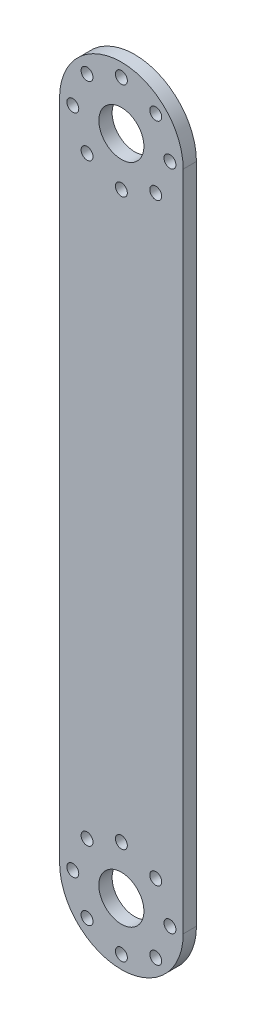
ISO-10303-21;
HEADER;
FILE_DESCRIPTION(('STEP AP214'),'2;1');
FILE_NAME('part.step','',(''),(''),'','','');
FILE_SCHEMA(('AUTOMOTIVE_DESIGN { 1 0 10303 214 1 1 1 1 }'));
ENDSEC;
DATA;
#1=APPLICATION_CONTEXT('core data for automotive mechanical design processes');
#2=APPLICATION_PROTOCOL_DEFINITION('international standard','automotive_design',2000,#1);
#3=PRODUCT_CONTEXT('',#1,'mechanical');
#4=PRODUCT('Part','Part','',(#3));
#5=PRODUCT_RELATED_PRODUCT_CATEGORY('part','',(#4));
#6=PRODUCT_DEFINITION_FORMATION('','',#4);
#7=PRODUCT_DEFINITION_CONTEXT('part definition',#1,'design');
#8=PRODUCT_DEFINITION('design','',#6,#7);
#9=PRODUCT_DEFINITION_SHAPE('','',#8);
#10=(LENGTH_UNIT() NAMED_UNIT(*) SI_UNIT(.MILLI.,.METRE.));
#11=(NAMED_UNIT(*) PLANE_ANGLE_UNIT() SI_UNIT($,.RADIAN.));
#12=(NAMED_UNIT(*) SI_UNIT($,.STERADIAN.) SOLID_ANGLE_UNIT());
#13=UNCERTAINTY_MEASURE_WITH_UNIT(LENGTH_MEASURE(1.E-05),#10,'distance_accuracy_value','');
#14=(GEOMETRIC_REPRESENTATION_CONTEXT(3) GLOBAL_UNCERTAINTY_ASSIGNED_CONTEXT((#13)) GLOBAL_UNIT_ASSIGNED_CONTEXT((#10,
#11,#12)) REPRESENTATION_CONTEXT('',''));
#15=CARTESIAN_POINT('',(0.,0.,0.));
#16=DIRECTION('',(0.,0.,1.));
#17=DIRECTION('',(1.,0.,0.));
#18=AXIS2_PLACEMENT_3D('',#15,#16,#17);
#19=CARTESIAN_POINT('',(0.,0.,3.));
#20=DIRECTION('',(0.,0.,1.));
#21=DIRECTION('',(1.,0.,0.));
#22=AXIS2_PLACEMENT_3D('',#19,#20,#21);
#23=PLANE('',#22);
#24=CARTESIAN_POINT('',(11.,-1.15218884181823E-13,3.));
#25=DIRECTION('',(0.,0.,1.));
#26=DIRECTION('',(1.,0.,0.));
#27=AXIS2_PLACEMENT_3D('',#24,#25,#26);
#28=CIRCLE('',#27,1.35);
#29=CARTESIAN_POINT('',(12.35,-1.15218884181823E-13,3.));
#30=VERTEX_POINT('',#29);
#31=EDGE_CURVE('E206',#30,#30,#28,.T.);
#32=ORIENTED_EDGE('',*,*,#31,.F.);
#33=EDGE_LOOP('',(#32));
#34=FACE_BOUND('',#33,.T.);
#35=CARTESIAN_POINT('',(0.,11.,3.));
#36=DIRECTION('',(0.,0.,1.));
#37=DIRECTION('',(1.,0.,0.));
#38=AXIS2_PLACEMENT_3D('',#35,#36,#37);
#39=CIRCLE('',#38,1.35);
#40=CARTESIAN_POINT('',(1.35000000000008,11.,3.));
#41=VERTEX_POINT('',#40);
#42=EDGE_CURVE('E194',#41,#41,#39,.T.);
#43=ORIENTED_EDGE('',*,*,#42,.F.);
#44=EDGE_LOOP('',(#43));
#45=FACE_BOUND('',#44,.T.);
#46=CARTESIAN_POINT('',(-11.,0.,3.));
#47=DIRECTION('',(0.,0.,1.));
#48=DIRECTION('',(1.,0.,0.));
#49=AXIS2_PLACEMENT_3D('',#46,#47,#48);
#50=CIRCLE('',#49,1.35);
#51=CARTESIAN_POINT('',(-9.65,0.,3.));
#52=VERTEX_POINT('',#51);
#53=EDGE_CURVE('E182',#52,#52,#50,.T.);
#54=ORIENTED_EDGE('',*,*,#53,.F.);
#55=EDGE_LOOP('',(#54));
#56=FACE_BOUND('',#55,.T.);
#57=CARTESIAN_POINT('',(0.,-11.,3.));
#58=DIRECTION('',(0.,0.,1.));
#59=DIRECTION('',(1.,0.,0.));
#60=AXIS2_PLACEMENT_3D('',#57,#58,#59);
#61=CIRCLE('',#60,1.35);
#62=CARTESIAN_POINT('',(1.35,-11.,3.));
#63=VERTEX_POINT('',#62);
#64=EDGE_CURVE('E170',#63,#63,#61,.T.);
#65=ORIENTED_EDGE('',*,*,#64,.F.);
#66=EDGE_LOOP('',(#65));
#67=FACE_BOUND('',#66,.T.);
#68=CARTESIAN_POINT('',(-11.,150.,3.));
#69=DIRECTION('',(0.,0.,1.));
#70=DIRECTION('',(1.,0.,0.));
#71=AXIS2_PLACEMENT_3D('',#68,#69,#70);
#72=CIRCLE('',#71,1.35);
#73=CARTESIAN_POINT('',(-9.65000000000001,150.,3.));
#74=VERTEX_POINT('',#73);
#75=EDGE_CURVE('E158',#74,#74,#72,.T.);
#76=ORIENTED_EDGE('',*,*,#75,.F.);
#77=EDGE_LOOP('',(#76));
#78=FACE_BOUND('',#77,.T.);
#79=CARTESIAN_POINT('',(0.,139.,3.));
#80=DIRECTION('',(0.,0.,1.));
#81=DIRECTION('',(1.,0.,0.));
#82=AXIS2_PLACEMENT_3D('',#79,#80,#81);
#83=CIRCLE('',#82,1.34999999999999);
#84=CARTESIAN_POINT('',(1.34999999999999,139.,3.));
#85=VERTEX_POINT('',#84);
#86=EDGE_CURVE('E146',#85,#85,#83,.T.);
#87=ORIENTED_EDGE('',*,*,#86,.F.);
#88=EDGE_LOOP('',(#87));
#89=FACE_BOUND('',#88,.T.);
#90=CARTESIAN_POINT('',(11.,150.,3.));
#91=DIRECTION('',(0.,0.,1.));
#92=DIRECTION('',(1.,0.,0.));
#93=AXIS2_PLACEMENT_3D('',#90,#91,#92);
#94=CIRCLE('',#93,1.34999999999998);
#95=CARTESIAN_POINT('',(12.35,150.,3.));
#96=VERTEX_POINT('',#95);
#97=EDGE_CURVE('E134',#96,#96,#94,.T.);
#98=ORIENTED_EDGE('',*,*,#97,.F.);
#99=EDGE_LOOP('',(#98));
#100=FACE_BOUND('',#99,.T.);
#101=CARTESIAN_POINT('',(0.,0.,3.));
#102=DIRECTION('',(0.,0.,1.));
#103=DIRECTION('',(1.,0.,0.));
#104=AXIS2_PLACEMENT_3D('',#101,#102,#103);
#105=CIRCLE('',#104,5.1);
#106=CARTESIAN_POINT('',(5.1,0.,3.));
#107=VERTEX_POINT('',#106);
#108=EDGE_CURVE('E122',#107,#107,#105,.T.);
#109=ORIENTED_EDGE('',*,*,#108,.F.);
#110=EDGE_LOOP('',(#109));
#111=FACE_BOUND('',#110,.T.);
#112=CARTESIAN_POINT('',(0.,161.,3.));
#113=DIRECTION('',(0.,0.,1.));
#114=DIRECTION('',(1.,0.,0.));
#115=AXIS2_PLACEMENT_3D('',#112,#113,#114);
#116=CIRCLE('',#115,1.34999999999999);
#117=CARTESIAN_POINT('',(1.34999999999999,161.,3.));
#118=VERTEX_POINT('',#117);
#119=EDGE_CURVE('E101',#118,#118,#116,.T.);
#120=ORIENTED_EDGE('',*,*,#119,.F.);
#121=EDGE_LOOP('',(#120));
#122=FACE_BOUND('',#121,.T.);
#123=CARTESIAN_POINT('',(0.,0.,3.));
#124=DIRECTION('',(0.,0.,1.));
#125=DIRECTION('',(1.,0.,0.));
#126=AXIS2_PLACEMENT_3D('',#123,#124,#125);
#127=CIRCLE('',#126,14.);
#128=CARTESIAN_POINT('',(-14.,0.,3.));
#129=VERTEX_POINT('',#128);
#130=CARTESIAN_POINT('',(14.,0.,3.));
#131=VERTEX_POINT('',#130);
#132=EDGE_CURVE('E86',#129,#131,#127,.T.);
#133=ORIENTED_EDGE('',*,*,#132,.T.);
#134=DIRECTION('',(0.,1.,0.));
#135=VECTOR('',#134,1.);
#136=CARTESIAN_POINT('',(14.,0.,3.));
#137=LINE('',#136,#135);
#138=CARTESIAN_POINT('',(14.,150.,3.));
#139=VERTEX_POINT('',#138);
#140=EDGE_CURVE('E81',#131,#139,#137,.T.);
#141=ORIENTED_EDGE('',*,*,#140,.T.);
#142=CARTESIAN_POINT('',(0.,150.,3.));
#143=DIRECTION('',(0.,0.,1.));
#144=DIRECTION('',(1.,0.,0.));
#145=AXIS2_PLACEMENT_3D('',#142,#143,#144);
#146=CIRCLE('',#145,14.);
#147=CARTESIAN_POINT('',(-14.,150.,3.));
#148=VERTEX_POINT('',#147);
#149=EDGE_CURVE('E84',#139,#148,#146,.T.);
#150=ORIENTED_EDGE('',*,*,#149,.T.);
#151=DIRECTION('',(0.,-1.,0.));
#152=VECTOR('',#151,1.);
#153=CARTESIAN_POINT('',(-14.,0.,3.));
#154=LINE('',#153,#152);
#155=EDGE_CURVE('E51',#148,#129,#154,.T.);
#156=ORIENTED_EDGE('',*,*,#155,.T.);
#157=EDGE_LOOP('',(#133,#141,#150,#156));
#158=FACE_BOUND('',#157,.T.);
#159=CARTESIAN_POINT('',(0.,150.,3.));
#160=DIRECTION('',(0.,0.,1.));
#161=DIRECTION('',(1.,0.,0.));
#162=AXIS2_PLACEMENT_3D('',#159,#160,#161);
#163=CIRCLE('',#162,5.09999999999999);
#164=CARTESIAN_POINT('',(5.09999999999999,150.,3.));
#165=VERTEX_POINT('',#164);
#166=EDGE_CURVE('E116',#165,#165,#163,.T.);
#167=ORIENTED_EDGE('',*,*,#166,.F.);
#168=EDGE_LOOP('',(#167));
#169=FACE_BOUND('',#168,.T.);
#170=CARTESIAN_POINT('',(7.77817459305202,157.778174593052,3.));
#171=DIRECTION('',(0.,0.,1.));
#172=DIRECTION('',(1.,0.,0.));
#173=AXIS2_PLACEMENT_3D('',#170,#171,#172);
#174=CIRCLE('',#173,1.34999999999999);
#175=CARTESIAN_POINT('',(9.12817459305201,157.778174593052,3.));
#176=VERTEX_POINT('',#175);
#177=EDGE_CURVE('E128',#176,#176,#174,.T.);
#178=ORIENTED_EDGE('',*,*,#177,.F.);
#179=EDGE_LOOP('',(#178));
#180=FACE_BOUND('',#179,.T.);
#181=CARTESIAN_POINT('',(7.77817459305204,142.221825406948,3.));
#182=DIRECTION('',(0.,0.,1.));
#183=DIRECTION('',(1.,0.,0.));
#184=AXIS2_PLACEMENT_3D('',#181,#182,#183);
#185=CIRCLE('',#184,1.34999999999998);
#186=CARTESIAN_POINT('',(9.12817459305202,142.221825406948,3.));
#187=VERTEX_POINT('',#186);
#188=EDGE_CURVE('E140',#187,#187,#185,.T.);
#189=ORIENTED_EDGE('',*,*,#188,.F.);
#190=EDGE_LOOP('',(#189));
#191=FACE_BOUND('',#190,.T.);
#192=CARTESIAN_POINT('',(-7.77817459305204,142.221825406948,3.));
#193=DIRECTION('',(0.,0.,1.));
#194=DIRECTION('',(1.,0.,0.));
#195=AXIS2_PLACEMENT_3D('',#192,#193,#194);
#196=CIRCLE('',#195,1.34999999999999);
#197=CARTESIAN_POINT('',(-6.42817459305205,142.221825406948,3.));
#198=VERTEX_POINT('',#197);
#199=EDGE_CURVE('E152',#198,#198,#196,.T.);
#200=ORIENTED_EDGE('',*,*,#199,.F.);
#201=EDGE_LOOP('',(#200));
#202=FACE_BOUND('',#201,.T.);
#203=CARTESIAN_POINT('',(-7.77817459305202,157.778174593052,3.));
#204=DIRECTION('',(0.,0.,1.));
#205=DIRECTION('',(1.,0.,0.));
#206=AXIS2_PLACEMENT_3D('',#203,#204,#205);
#207=CIRCLE('',#206,1.34999999999998);
#208=CARTESIAN_POINT('',(-6.42817459305205,157.778174593052,3.));
#209=VERTEX_POINT('',#208);
#210=EDGE_CURVE('E164',#209,#209,#207,.T.);
#211=ORIENTED_EDGE('',*,*,#210,.F.);
#212=EDGE_LOOP('',(#211));
#213=FACE_BOUND('',#212,.T.);
#214=CARTESIAN_POINT('',(-7.77817459305203,-7.77817459305201,3.));
#215=DIRECTION('',(0.,0.,1.));
#216=DIRECTION('',(1.,0.,0.));
#217=AXIS2_PLACEMENT_3D('',#214,#215,#216);
#218=CIRCLE('',#217,1.35);
#219=CARTESIAN_POINT('',(-6.42817459305203,-7.77817459305201,3.));
#220=VERTEX_POINT('',#219);
#221=EDGE_CURVE('E176',#220,#220,#218,.T.);
#222=ORIENTED_EDGE('',*,*,#221,.F.);
#223=EDGE_LOOP('',(#222));
#224=FACE_BOUND('',#223,.T.);
#225=CARTESIAN_POINT('',(-7.77817459305199,7.77817459305206,3.));
#226=DIRECTION('',(0.,0.,1.));
#227=DIRECTION('',(1.,0.,0.));
#228=AXIS2_PLACEMENT_3D('',#225,#226,#227);
#229=CIRCLE('',#228,1.35);
#230=CARTESIAN_POINT('',(-6.42817459305199,7.77817459305206,3.));
#231=VERTEX_POINT('',#230);
#232=EDGE_CURVE('E188',#231,#231,#229,.T.);
#233=ORIENTED_EDGE('',*,*,#232,.F.);
#234=EDGE_LOOP('',(#233));
#235=FACE_BOUND('',#234,.T.);
#236=CARTESIAN_POINT('',(7.77817459305209,7.77817459305195,3.));
#237=DIRECTION('',(0.,0.,1.));
#238=DIRECTION('',(1.,0.,0.));
#239=AXIS2_PLACEMENT_3D('',#236,#237,#238);
#240=CIRCLE('',#239,1.35);
#241=CARTESIAN_POINT('',(9.12817459305209,7.77817459305195,3.));
#242=VERTEX_POINT('',#241);
#243=EDGE_CURVE('E200',#242,#242,#240,.T.);
#244=ORIENTED_EDGE('',*,*,#243,.F.);
#245=EDGE_LOOP('',(#244));
#246=FACE_BOUND('',#245,.T.);
#247=CARTESIAN_POINT('',(7.77817459305193,-7.77817459305212,3.));
#248=DIRECTION('',(0.,0.,1.));
#249=DIRECTION('',(1.,0.,0.));
#250=AXIS2_PLACEMENT_3D('',#247,#248,#249);
#251=CIRCLE('',#250,1.35);
#252=CARTESIAN_POINT('',(9.12817459305193,-7.77817459305212,3.));
#253=VERTEX_POINT('',#252);
#254=EDGE_CURVE('E212',#253,#253,#251,.T.);
#255=ORIENTED_EDGE('',*,*,#254,.F.);
#256=EDGE_LOOP('',(#255));
#257=FACE_BOUND('',#256,.T.);
#258=ADVANCED_FACE('F34',(#34,#45,#56,#67,#78,#89,#100,#111,#122,#158,#169,#180,#191,#202,#213,
#224,#235,#246,#257),#23,.T.);
#259=CARTESIAN_POINT('',(0.,0.,0.));
#260=DIRECTION('',(0.,0.,1.));
#261=DIRECTION('',(1.,0.,0.));
#262=AXIS2_PLACEMENT_3D('',#259,#260,#261);
#263=PLANE('',#262);
#264=CARTESIAN_POINT('',(0.,0.,0.));
#265=DIRECTION('',(0.,0.,1.));
#266=DIRECTION('',(1.,0.,0.));
#267=AXIS2_PLACEMENT_3D('',#264,#265,#266);
#268=CIRCLE('',#267,14.);
#269=CARTESIAN_POINT('',(-14.,0.,0.));
#270=VERTEX_POINT('',#269);
#271=CARTESIAN_POINT('',(14.,0.,0.));
#272=VERTEX_POINT('',#271);
#273=EDGE_CURVE('E98',#270,#272,#268,.T.);
#274=ORIENTED_EDGE('',*,*,#273,.F.);
#275=DIRECTION('',(0.,-1.,0.));
#276=VECTOR('',#275,1.);
#277=CARTESIAN_POINT('',(-14.,0.,0.));
#278=LINE('',#277,#276);
#279=CARTESIAN_POINT('',(-14.,150.,0.));
#280=VERTEX_POINT('',#279);
#281=EDGE_CURVE('E74',#280,#270,#278,.T.);
#282=ORIENTED_EDGE('',*,*,#281,.F.);
#283=CARTESIAN_POINT('',(0.,150.,0.));
#284=DIRECTION('',(0.,0.,1.));
#285=DIRECTION('',(1.,0.,0.));
#286=AXIS2_PLACEMENT_3D('',#283,#284,#285);
#287=CIRCLE('',#286,14.);
#288=CARTESIAN_POINT('',(14.,150.,0.));
#289=VERTEX_POINT('',#288);
#290=EDGE_CURVE('E68',#289,#280,#287,.T.);
#291=ORIENTED_EDGE('',*,*,#290,.F.);
#292=DIRECTION('',(0.,1.,0.));
#293=VECTOR('',#292,1.);
#294=CARTESIAN_POINT('',(14.,0.,0.));
#295=LINE('',#294,#293);
#296=EDGE_CURVE('E90',#272,#289,#295,.T.);
#297=ORIENTED_EDGE('',*,*,#296,.F.);
#298=EDGE_LOOP('',(#274,#282,#291,#297));
#299=FACE_BOUND('',#298,.T.);
#300=CARTESIAN_POINT('',(0.,161.,0.));
#301=DIRECTION('',(0.,0.,1.));
#302=DIRECTION('',(1.,0.,0.));
#303=AXIS2_PLACEMENT_3D('',#300,#301,#302);
#304=CIRCLE('',#303,1.34999999999999);
#305=CARTESIAN_POINT('',(1.34999999999999,161.,0.));
#306=VERTEX_POINT('',#305);
#307=EDGE_CURVE('E113',#306,#306,#304,.T.);
#308=ORIENTED_EDGE('',*,*,#307,.T.);
#309=EDGE_LOOP('',(#308));
#310=FACE_BOUND('',#309,.T.);
#311=CARTESIAN_POINT('',(0.,150.,0.));
#312=DIRECTION('',(0.,0.,1.));
#313=DIRECTION('',(1.,0.,0.));
#314=AXIS2_PLACEMENT_3D('',#311,#312,#313);
#315=CIRCLE('',#314,5.09999999999999);
#316=CARTESIAN_POINT('',(5.09999999999999,150.,0.));
#317=VERTEX_POINT('',#316);
#318=EDGE_CURVE('E119',#317,#317,#315,.T.);
#319=ORIENTED_EDGE('',*,*,#318,.T.);
#320=EDGE_LOOP('',(#319));
#321=FACE_BOUND('',#320,.T.);
#322=CARTESIAN_POINT('',(0.,0.,0.));
#323=DIRECTION('',(0.,0.,1.));
#324=DIRECTION('',(1.,0.,0.));
#325=AXIS2_PLACEMENT_3D('',#322,#323,#324);
#326=CIRCLE('',#325,5.1);
#327=CARTESIAN_POINT('',(5.1,0.,0.));
#328=VERTEX_POINT('',#327);
#329=EDGE_CURVE('E125',#328,#328,#326,.T.);
#330=ORIENTED_EDGE('',*,*,#329,.T.);
#331=EDGE_LOOP('',(#330));
#332=FACE_BOUND('',#331,.T.);
#333=CARTESIAN_POINT('',(7.77817459305202,157.778174593052,0.));
#334=DIRECTION('',(0.,0.,1.));
#335=DIRECTION('',(1.,0.,0.));
#336=AXIS2_PLACEMENT_3D('',#333,#334,#335);
#337=CIRCLE('',#336,1.34999999999999);
#338=CARTESIAN_POINT('',(9.12817459305201,157.778174593052,0.));
#339=VERTEX_POINT('',#338);
#340=EDGE_CURVE('E131',#339,#339,#337,.T.);
#341=ORIENTED_EDGE('',*,*,#340,.T.);
#342=EDGE_LOOP('',(#341));
#343=FACE_BOUND('',#342,.T.);
#344=CARTESIAN_POINT('',(11.,150.,0.));
#345=DIRECTION('',(0.,0.,1.));
#346=DIRECTION('',(1.,0.,0.));
#347=AXIS2_PLACEMENT_3D('',#344,#345,#346);
#348=CIRCLE('',#347,1.34999999999998);
#349=CARTESIAN_POINT('',(12.35,150.,0.));
#350=VERTEX_POINT('',#349);
#351=EDGE_CURVE('E137',#350,#350,#348,.T.);
#352=ORIENTED_EDGE('',*,*,#351,.T.);
#353=EDGE_LOOP('',(#352));
#354=FACE_BOUND('',#353,.T.);
#355=CARTESIAN_POINT('',(7.77817459305204,142.221825406948,0.));
#356=DIRECTION('',(0.,0.,1.));
#357=DIRECTION('',(1.,0.,0.));
#358=AXIS2_PLACEMENT_3D('',#355,#356,#357);
#359=CIRCLE('',#358,1.34999999999998);
#360=CARTESIAN_POINT('',(9.12817459305202,142.221825406948,0.));
#361=VERTEX_POINT('',#360);
#362=EDGE_CURVE('E143',#361,#361,#359,.T.);
#363=ORIENTED_EDGE('',*,*,#362,.T.);
#364=EDGE_LOOP('',(#363));
#365=FACE_BOUND('',#364,.T.);
#366=CARTESIAN_POINT('',(0.,139.,0.));
#367=DIRECTION('',(0.,0.,1.));
#368=DIRECTION('',(1.,0.,0.));
#369=AXIS2_PLACEMENT_3D('',#366,#367,#368);
#370=CIRCLE('',#369,1.34999999999999);
#371=CARTESIAN_POINT('',(1.34999999999999,139.,0.));
#372=VERTEX_POINT('',#371);
#373=EDGE_CURVE('E149',#372,#372,#370,.T.);
#374=ORIENTED_EDGE('',*,*,#373,.T.);
#375=EDGE_LOOP('',(#374));
#376=FACE_BOUND('',#375,.T.);
#377=CARTESIAN_POINT('',(-7.77817459305204,142.221825406948,0.));
#378=DIRECTION('',(0.,0.,1.));
#379=DIRECTION('',(1.,0.,0.));
#380=AXIS2_PLACEMENT_3D('',#377,#378,#379);
#381=CIRCLE('',#380,1.34999999999999);
#382=CARTESIAN_POINT('',(-6.42817459305205,142.221825406948,0.));
#383=VERTEX_POINT('',#382);
#384=EDGE_CURVE('E155',#383,#383,#381,.T.);
#385=ORIENTED_EDGE('',*,*,#384,.T.);
#386=EDGE_LOOP('',(#385));
#387=FACE_BOUND('',#386,.T.);
#388=CARTESIAN_POINT('',(-11.,150.,0.));
#389=DIRECTION('',(0.,0.,1.));
#390=DIRECTION('',(1.,0.,0.));
#391=AXIS2_PLACEMENT_3D('',#388,#389,#390);
#392=CIRCLE('',#391,1.35);
#393=CARTESIAN_POINT('',(-9.65000000000001,150.,0.));
#394=VERTEX_POINT('',#393);
#395=EDGE_CURVE('E161',#394,#394,#392,.T.);
#396=ORIENTED_EDGE('',*,*,#395,.T.);
#397=EDGE_LOOP('',(#396));
#398=FACE_BOUND('',#397,.T.);
#399=CARTESIAN_POINT('',(-7.77817459305202,157.778174593052,0.));
#400=DIRECTION('',(0.,0.,1.));
#401=DIRECTION('',(1.,0.,0.));
#402=AXIS2_PLACEMENT_3D('',#399,#400,#401);
#403=CIRCLE('',#402,1.34999999999998);
#404=CARTESIAN_POINT('',(-6.42817459305205,157.778174593052,0.));
#405=VERTEX_POINT('',#404);
#406=EDGE_CURVE('E167',#405,#405,#403,.T.);
#407=ORIENTED_EDGE('',*,*,#406,.T.);
#408=EDGE_LOOP('',(#407));
#409=FACE_BOUND('',#408,.T.);
#410=CARTESIAN_POINT('',(0.,-11.,0.));
#411=DIRECTION('',(0.,0.,1.));
#412=DIRECTION('',(1.,0.,0.));
#413=AXIS2_PLACEMENT_3D('',#410,#411,#412);
#414=CIRCLE('',#413,1.35);
#415=CARTESIAN_POINT('',(1.35,-11.,0.));
#416=VERTEX_POINT('',#415);
#417=EDGE_CURVE('E173',#416,#416,#414,.T.);
#418=ORIENTED_EDGE('',*,*,#417,.T.);
#419=EDGE_LOOP('',(#418));
#420=FACE_BOUND('',#419,.T.);
#421=CARTESIAN_POINT('',(-7.77817459305203,-7.77817459305201,0.));
#422=DIRECTION('',(0.,0.,1.));
#423=DIRECTION('',(1.,0.,0.));
#424=AXIS2_PLACEMENT_3D('',#421,#422,#423);
#425=CIRCLE('',#424,1.35);
#426=CARTESIAN_POINT('',(-6.42817459305203,-7.77817459305201,0.));
#427=VERTEX_POINT('',#426);
#428=EDGE_CURVE('E179',#427,#427,#425,.T.);
#429=ORIENTED_EDGE('',*,*,#428,.T.);
#430=EDGE_LOOP('',(#429));
#431=FACE_BOUND('',#430,.T.);
#432=CARTESIAN_POINT('',(-11.,0.,0.));
#433=DIRECTION('',(0.,0.,1.));
#434=DIRECTION('',(1.,0.,0.));
#435=AXIS2_PLACEMENT_3D('',#432,#433,#434);
#436=CIRCLE('',#435,1.35);
#437=CARTESIAN_POINT('',(-9.65,0.,0.));
#438=VERTEX_POINT('',#437);
#439=EDGE_CURVE('E185',#438,#438,#436,.T.);
#440=ORIENTED_EDGE('',*,*,#439,.T.);
#441=EDGE_LOOP('',(#440));
#442=FACE_BOUND('',#441,.T.);
#443=CARTESIAN_POINT('',(-7.77817459305199,7.77817459305206,0.));
#444=DIRECTION('',(0.,0.,1.));
#445=DIRECTION('',(1.,0.,0.));
#446=AXIS2_PLACEMENT_3D('',#443,#444,#445);
#447=CIRCLE('',#446,1.35);
#448=CARTESIAN_POINT('',(-6.42817459305199,7.77817459305206,0.));
#449=VERTEX_POINT('',#448);
#450=EDGE_CURVE('E191',#449,#449,#447,.T.);
#451=ORIENTED_EDGE('',*,*,#450,.T.);
#452=EDGE_LOOP('',(#451));
#453=FACE_BOUND('',#452,.T.);
#454=CARTESIAN_POINT('',(0.,11.,0.));
#455=DIRECTION('',(0.,0.,1.));
#456=DIRECTION('',(1.,0.,0.));
#457=AXIS2_PLACEMENT_3D('',#454,#455,#456);
#458=CIRCLE('',#457,1.35);
#459=CARTESIAN_POINT('',(1.35000000000008,11.,0.));
#460=VERTEX_POINT('',#459);
#461=EDGE_CURVE('E197',#460,#460,#458,.T.);
#462=ORIENTED_EDGE('',*,*,#461,.T.);
#463=EDGE_LOOP('',(#462));
#464=FACE_BOUND('',#463,.T.);
#465=CARTESIAN_POINT('',(7.77817459305209,7.77817459305195,0.));
#466=DIRECTION('',(0.,0.,1.));
#467=DIRECTION('',(1.,0.,0.));
#468=AXIS2_PLACEMENT_3D('',#465,#466,#467);
#469=CIRCLE('',#468,1.35);
#470=CARTESIAN_POINT('',(9.12817459305209,7.77817459305195,0.));
#471=VERTEX_POINT('',#470);
#472=EDGE_CURVE('E203',#471,#471,#469,.T.);
#473=ORIENTED_EDGE('',*,*,#472,.T.);
#474=EDGE_LOOP('',(#473));
#475=FACE_BOUND('',#474,.T.);
#476=CARTESIAN_POINT('',(11.,-1.15218884181823E-13,0.));
#477=DIRECTION('',(0.,0.,1.));
#478=DIRECTION('',(1.,0.,0.));
#479=AXIS2_PLACEMENT_3D('',#476,#477,#478);
#480=CIRCLE('',#479,1.35);
#481=CARTESIAN_POINT('',(12.35,-1.15218884181823E-13,0.));
#482=VERTEX_POINT('',#481);
#483=EDGE_CURVE('E209',#482,#482,#480,.T.);
#484=ORIENTED_EDGE('',*,*,#483,.T.);
#485=EDGE_LOOP('',(#484));
#486=FACE_BOUND('',#485,.T.);
#487=CARTESIAN_POINT('',(7.77817459305193,-7.77817459305212,0.));
#488=DIRECTION('',(0.,0.,1.));
#489=DIRECTION('',(1.,0.,0.));
#490=AXIS2_PLACEMENT_3D('',#487,#488,#489);
#491=CIRCLE('',#490,1.35);
#492=CARTESIAN_POINT('',(9.12817459305193,-7.77817459305212,0.));
#493=VERTEX_POINT('',#492);
#494=EDGE_CURVE('E215',#493,#493,#491,.T.);
#495=ORIENTED_EDGE('',*,*,#494,.T.);
#496=EDGE_LOOP('',(#495));
#497=FACE_BOUND('',#496,.T.);
#498=ADVANCED_FACE('F109',(#299,#310,#321,#332,#343,#354,#365,#376,#387,#398,#409,#420,#431,
#442,#453,#464,#475,#486,#497),#263,.F.);
#499=CARTESIAN_POINT('',(0.,0.,3.));
#500=DIRECTION('',(0.,0.,-1.));
#501=DIRECTION('',(-1.,0.,0.));
#502=AXIS2_PLACEMENT_3D('',#499,#500,#501);
#503=CYLINDRICAL_SURFACE('',#502,14.);
#504=ORIENTED_EDGE('',*,*,#273,.T.);
#505=DIRECTION('',(0.,0.,-1.));
#506=VECTOR('',#505,1.);
#507=CARTESIAN_POINT('',(14.,0.,3.));
#508=LINE('',#507,#506);
#509=EDGE_CURVE('E11',#131,#272,#508,.T.);
#510=ORIENTED_EDGE('',*,*,#509,.F.);
#511=ORIENTED_EDGE('',*,*,#132,.F.);
#512=DIRECTION('',(0.,0.,-1.));
#513=VECTOR('',#512,1.);
#514=CARTESIAN_POINT('',(-14.,0.,3.));
#515=LINE('',#514,#513);
#516=EDGE_CURVE('E94',#129,#270,#515,.T.);
#517=ORIENTED_EDGE('',*,*,#516,.T.);
#518=EDGE_LOOP('',(#504,#510,#511,#517));
#519=FACE_BOUND('',#518,.T.);
#520=ADVANCED_FACE('F36',(#519),#503,.T.);
#521=CARTESIAN_POINT('',(14.,0.,3.));
#522=DIRECTION('',(-1.,0.,0.));
#523=DIRECTION('',(0.,0.,1.));
#524=AXIS2_PLACEMENT_3D('',#521,#522,#523);
#525=PLANE('',#524);
#526=ORIENTED_EDGE('',*,*,#296,.T.);
#527=DIRECTION('',(0.,0.,-1.));
#528=VECTOR('',#527,1.);
#529=CARTESIAN_POINT('',(14.,150.,3.));
#530=LINE('',#529,#528);
#531=EDGE_CURVE('E43',#139,#289,#530,.T.);
#532=ORIENTED_EDGE('',*,*,#531,.F.);
#533=ORIENTED_EDGE('',*,*,#140,.F.);
#534=ORIENTED_EDGE('',*,*,#509,.T.);
#535=EDGE_LOOP('',(#526,#532,#533,#534));
#536=FACE_BOUND('',#535,.T.);
#537=ADVANCED_FACE('F89',(#536),#525,.F.);
#538=CARTESIAN_POINT('',(0.,150.,3.));
#539=DIRECTION('',(0.,0.,-1.));
#540=DIRECTION('',(-1.,0.,0.));
#541=AXIS2_PLACEMENT_3D('',#538,#539,#540);
#542=CYLINDRICAL_SURFACE('',#541,14.);
#543=ORIENTED_EDGE('',*,*,#290,.T.);
#544=DIRECTION('',(0.,0.,-1.));
#545=VECTOR('',#544,1.);
#546=CARTESIAN_POINT('',(-14.,150.,3.));
#547=LINE('',#546,#545);
#548=EDGE_CURVE('E91',#148,#280,#547,.T.);
#549=ORIENTED_EDGE('',*,*,#548,.F.);
#550=ORIENTED_EDGE('',*,*,#149,.F.);
#551=ORIENTED_EDGE('',*,*,#531,.T.);
#552=EDGE_LOOP('',(#543,#549,#550,#551));
#553=FACE_BOUND('',#552,.T.);
#554=ADVANCED_FACE('F92',(#553),#542,.T.);
#555=CARTESIAN_POINT('',(-14.,0.,3.));
#556=DIRECTION('',(1.,0.,0.));
#557=DIRECTION('',(0.,0.,-1.));
#558=AXIS2_PLACEMENT_3D('',#555,#556,#557);
#559=PLANE('',#558);
#560=ORIENTED_EDGE('',*,*,#281,.T.);
#561=ORIENTED_EDGE('',*,*,#516,.F.);
#562=ORIENTED_EDGE('',*,*,#155,.F.);
#563=ORIENTED_EDGE('',*,*,#548,.T.);
#564=EDGE_LOOP('',(#560,#561,#562,#563));
#565=FACE_BOUND('',#564,.T.);
#566=ADVANCED_FACE('F106',(#565),#559,.F.);
#567=CARTESIAN_POINT('',(0.,161.,3.));
#568=DIRECTION('',(0.,0.,-1.));
#569=DIRECTION('',(-1.,0.,0.));
#570=AXIS2_PLACEMENT_3D('',#567,#568,#569);
#571=CYLINDRICAL_SURFACE('',#570,1.34999999999999);
#572=ORIENTED_EDGE('',*,*,#119,.T.);
#573=EDGE_LOOP('',(#572));
#574=FACE_BOUND('',#573,.T.);
#575=ORIENTED_EDGE('',*,*,#307,.F.);
#576=EDGE_LOOP('',(#575));
#577=FACE_BOUND('',#576,.T.);
#578=ADVANCED_FACE('F234',(#574,#577),#571,.F.);
#579=CARTESIAN_POINT('',(0.,150.,3.));
#580=DIRECTION('',(0.,0.,-1.));
#581=DIRECTION('',(-1.,0.,0.));
#582=AXIS2_PLACEMENT_3D('',#579,#580,#581);
#583=CYLINDRICAL_SURFACE('',#582,5.09999999999999);
#584=ORIENTED_EDGE('',*,*,#166,.T.);
#585=EDGE_LOOP('',(#584));
#586=FACE_BOUND('',#585,.T.);
#587=ORIENTED_EDGE('',*,*,#318,.F.);
#588=EDGE_LOOP('',(#587));
#589=FACE_BOUND('',#588,.T.);
#590=ADVANCED_FACE('F280',(#586,#589),#583,.F.);
#591=CARTESIAN_POINT('',(0.,0.,3.));
#592=DIRECTION('',(0.,0.,-1.));
#593=DIRECTION('',(-1.,0.,0.));
#594=AXIS2_PLACEMENT_3D('',#591,#592,#593);
#595=CYLINDRICAL_SURFACE('',#594,5.1);
#596=ORIENTED_EDGE('',*,*,#108,.T.);
#597=EDGE_LOOP('',(#596));
#598=FACE_BOUND('',#597,.T.);
#599=ORIENTED_EDGE('',*,*,#329,.F.);
#600=EDGE_LOOP('',(#599));
#601=FACE_BOUND('',#600,.T.);
#602=ADVANCED_FACE('F288',(#598,#601),#595,.F.);
#603=CARTESIAN_POINT('',(7.77817459305202,157.778174593052,3.));
#604=DIRECTION('',(0.,0.,-1.));
#605=DIRECTION('',(-1.,0.,0.));
#606=AXIS2_PLACEMENT_3D('',#603,#604,#605);
#607=CYLINDRICAL_SURFACE('',#606,1.34999999999999);
#608=ORIENTED_EDGE('',*,*,#177,.T.);
#609=EDGE_LOOP('',(#608));
#610=FACE_BOUND('',#609,.T.);
#611=ORIENTED_EDGE('',*,*,#340,.F.);
#612=EDGE_LOOP('',(#611));
#613=FACE_BOUND('',#612,.T.);
#614=ADVANCED_FACE('F296',(#610,#613),#607,.F.);
#615=CARTESIAN_POINT('',(11.,150.,3.));
#616=DIRECTION('',(0.,0.,-1.));
#617=DIRECTION('',(-1.,0.,0.));
#618=AXIS2_PLACEMENT_3D('',#615,#616,#617);
#619=CYLINDRICAL_SURFACE('',#618,1.34999999999998);
#620=ORIENTED_EDGE('',*,*,#97,.T.);
#621=EDGE_LOOP('',(#620));
#622=FACE_BOUND('',#621,.T.);
#623=ORIENTED_EDGE('',*,*,#351,.F.);
#624=EDGE_LOOP('',(#623));
#625=FACE_BOUND('',#624,.T.);
#626=ADVANCED_FACE('F305',(#622,#625),#619,.F.);
#627=CARTESIAN_POINT('',(7.77817459305204,142.221825406948,3.));
#628=DIRECTION('',(0.,0.,-1.));
#629=DIRECTION('',(-1.,0.,0.));
#630=AXIS2_PLACEMENT_3D('',#627,#628,#629);
#631=CYLINDRICAL_SURFACE('',#630,1.34999999999998);
#632=ORIENTED_EDGE('',*,*,#188,.T.);
#633=EDGE_LOOP('',(#632));
#634=FACE_BOUND('',#633,.T.);
#635=ORIENTED_EDGE('',*,*,#362,.F.);
#636=EDGE_LOOP('',(#635));
#637=FACE_BOUND('',#636,.T.);
#638=ADVANCED_FACE('F314',(#634,#637),#631,.F.);
#639=CARTESIAN_POINT('',(0.,139.,3.));
#640=DIRECTION('',(0.,0.,-1.));
#641=DIRECTION('',(-1.,0.,0.));
#642=AXIS2_PLACEMENT_3D('',#639,#640,#641);
#643=CYLINDRICAL_SURFACE('',#642,1.34999999999999);
#644=ORIENTED_EDGE('',*,*,#86,.T.);
#645=EDGE_LOOP('',(#644));
#646=FACE_BOUND('',#645,.T.);
#647=ORIENTED_EDGE('',*,*,#373,.F.);
#648=EDGE_LOOP('',(#647));
#649=FACE_BOUND('',#648,.T.);
#650=ADVANCED_FACE('F323',(#646,#649),#643,.F.);
#651=CARTESIAN_POINT('',(-7.77817459305204,142.221825406948,3.));
#652=DIRECTION('',(0.,0.,-1.));
#653=DIRECTION('',(-1.,0.,0.));
#654=AXIS2_PLACEMENT_3D('',#651,#652,#653);
#655=CYLINDRICAL_SURFACE('',#654,1.34999999999999);
#656=ORIENTED_EDGE('',*,*,#199,.T.);
#657=EDGE_LOOP('',(#656));
#658=FACE_BOUND('',#657,.T.);
#659=ORIENTED_EDGE('',*,*,#384,.F.);
#660=EDGE_LOOP('',(#659));
#661=FACE_BOUND('',#660,.T.);
#662=ADVANCED_FACE('F332',(#658,#661),#655,.F.);
#663=CARTESIAN_POINT('',(-11.,150.,3.));
#664=DIRECTION('',(0.,0.,-1.));
#665=DIRECTION('',(-1.,0.,0.));
#666=AXIS2_PLACEMENT_3D('',#663,#664,#665);
#667=CYLINDRICAL_SURFACE('',#666,1.35);
#668=ORIENTED_EDGE('',*,*,#75,.T.);
#669=EDGE_LOOP('',(#668));
#670=FACE_BOUND('',#669,.T.);
#671=ORIENTED_EDGE('',*,*,#395,.F.);
#672=EDGE_LOOP('',(#671));
#673=FACE_BOUND('',#672,.T.);
#674=ADVANCED_FACE('F341',(#670,#673),#667,.F.);
#675=CARTESIAN_POINT('',(-7.77817459305202,157.778174593052,3.));
#676=DIRECTION('',(0.,0.,-1.));
#677=DIRECTION('',(-1.,0.,0.));
#678=AXIS2_PLACEMENT_3D('',#675,#676,#677);
#679=CYLINDRICAL_SURFACE('',#678,1.34999999999998);
#680=ORIENTED_EDGE('',*,*,#210,.T.);
#681=EDGE_LOOP('',(#680));
#682=FACE_BOUND('',#681,.T.);
#683=ORIENTED_EDGE('',*,*,#406,.F.);
#684=EDGE_LOOP('',(#683));
#685=FACE_BOUND('',#684,.T.);
#686=ADVANCED_FACE('F350',(#682,#685),#679,.F.);
#687=CARTESIAN_POINT('',(0.,-11.,3.));
#688=DIRECTION('',(0.,0.,-1.));
#689=DIRECTION('',(-1.,0.,0.));
#690=AXIS2_PLACEMENT_3D('',#687,#688,#689);
#691=CYLINDRICAL_SURFACE('',#690,1.35);
#692=ORIENTED_EDGE('',*,*,#64,.T.);
#693=EDGE_LOOP('',(#692));
#694=FACE_BOUND('',#693,.T.);
#695=ORIENTED_EDGE('',*,*,#417,.F.);
#696=EDGE_LOOP('',(#695));
#697=FACE_BOUND('',#696,.T.);
#698=ADVANCED_FACE('F359',(#694,#697),#691,.F.);
#699=CARTESIAN_POINT('',(-7.77817459305203,-7.77817459305201,3.));
#700=DIRECTION('',(0.,0.,-1.));
#701=DIRECTION('',(-1.,0.,0.));
#702=AXIS2_PLACEMENT_3D('',#699,#700,#701);
#703=CYLINDRICAL_SURFACE('',#702,1.35);
#704=ORIENTED_EDGE('',*,*,#221,.T.);
#705=EDGE_LOOP('',(#704));
#706=FACE_BOUND('',#705,.T.);
#707=ORIENTED_EDGE('',*,*,#428,.F.);
#708=EDGE_LOOP('',(#707));
#709=FACE_BOUND('',#708,.T.);
#710=ADVANCED_FACE('F368',(#706,#709),#703,.F.);
#711=CARTESIAN_POINT('',(-11.,0.,3.));
#712=DIRECTION('',(0.,0.,-1.));
#713=DIRECTION('',(-1.,0.,0.));
#714=AXIS2_PLACEMENT_3D('',#711,#712,#713);
#715=CYLINDRICAL_SURFACE('',#714,1.35);
#716=ORIENTED_EDGE('',*,*,#53,.T.);
#717=EDGE_LOOP('',(#716));
#718=FACE_BOUND('',#717,.T.);
#719=ORIENTED_EDGE('',*,*,#439,.F.);
#720=EDGE_LOOP('',(#719));
#721=FACE_BOUND('',#720,.T.);
#722=ADVANCED_FACE('F377',(#718,#721),#715,.F.);
#723=CARTESIAN_POINT('',(-7.77817459305199,7.77817459305206,3.));
#724=DIRECTION('',(0.,0.,-1.));
#725=DIRECTION('',(-1.,0.,0.));
#726=AXIS2_PLACEMENT_3D('',#723,#724,#725);
#727=CYLINDRICAL_SURFACE('',#726,1.35);
#728=ORIENTED_EDGE('',*,*,#232,.T.);
#729=EDGE_LOOP('',(#728));
#730=FACE_BOUND('',#729,.T.);
#731=ORIENTED_EDGE('',*,*,#450,.F.);
#732=EDGE_LOOP('',(#731));
#733=FACE_BOUND('',#732,.T.);
#734=ADVANCED_FACE('F386',(#730,#733),#727,.F.);
#735=CARTESIAN_POINT('',(0.,11.,3.));
#736=DIRECTION('',(0.,0.,-1.));
#737=DIRECTION('',(-1.,0.,0.));
#738=AXIS2_PLACEMENT_3D('',#735,#736,#737);
#739=CYLINDRICAL_SURFACE('',#738,1.35);
#740=ORIENTED_EDGE('',*,*,#42,.T.);
#741=EDGE_LOOP('',(#740));
#742=FACE_BOUND('',#741,.T.);
#743=ORIENTED_EDGE('',*,*,#461,.F.);
#744=EDGE_LOOP('',(#743));
#745=FACE_BOUND('',#744,.T.);
#746=ADVANCED_FACE('F395',(#742,#745),#739,.F.);
#747=CARTESIAN_POINT('',(7.77817459305209,7.77817459305195,3.));
#748=DIRECTION('',(0.,0.,-1.));
#749=DIRECTION('',(-1.,0.,0.));
#750=AXIS2_PLACEMENT_3D('',#747,#748,#749);
#751=CYLINDRICAL_SURFACE('',#750,1.35);
#752=ORIENTED_EDGE('',*,*,#243,.T.);
#753=EDGE_LOOP('',(#752));
#754=FACE_BOUND('',#753,.T.);
#755=ORIENTED_EDGE('',*,*,#472,.F.);
#756=EDGE_LOOP('',(#755));
#757=FACE_BOUND('',#756,.T.);
#758=ADVANCED_FACE('F404',(#754,#757),#751,.F.);
#759=CARTESIAN_POINT('',(11.,-1.15218884181823E-13,3.));
#760=DIRECTION('',(0.,0.,-1.));
#761=DIRECTION('',(-1.,0.,0.));
#762=AXIS2_PLACEMENT_3D('',#759,#760,#761);
#763=CYLINDRICAL_SURFACE('',#762,1.35);
#764=ORIENTED_EDGE('',*,*,#31,.T.);
#765=EDGE_LOOP('',(#764));
#766=FACE_BOUND('',#765,.T.);
#767=ORIENTED_EDGE('',*,*,#483,.F.);
#768=EDGE_LOOP('',(#767));
#769=FACE_BOUND('',#768,.T.);
#770=ADVANCED_FACE('F413',(#766,#769),#763,.F.);
#771=CARTESIAN_POINT('',(7.77817459305193,-7.77817459305212,3.));
#772=DIRECTION('',(0.,0.,-1.));
#773=DIRECTION('',(-1.,0.,0.));
#774=AXIS2_PLACEMENT_3D('',#771,#772,#773);
#775=CYLINDRICAL_SURFACE('',#774,1.35);
#776=ORIENTED_EDGE('',*,*,#254,.T.);
#777=EDGE_LOOP('',(#776));
#778=FACE_BOUND('',#777,.T.);
#779=ORIENTED_EDGE('',*,*,#494,.F.);
#780=EDGE_LOOP('',(#779));
#781=FACE_BOUND('',#780,.T.);
#782=ADVANCED_FACE('F221',(#778,#781),#775,.F.);
#783=CLOSED_SHELL('',(#258,#498,#520,#537,#554,#566,#578,#590,#602,#614,#626,#638,#650,#662,
#674,#686,#698,#710,#722,#734,#746,#758,#770,#782));
#784=MANIFOLD_SOLID_BREP('B2',#783);
#785=ADVANCED_BREP_SHAPE_REPRESENTATION('',(#18,#784),#14);
#786=SHAPE_DEFINITION_REPRESENTATION(#9,#785);
ENDSEC;
END-ISO-10303-21;
